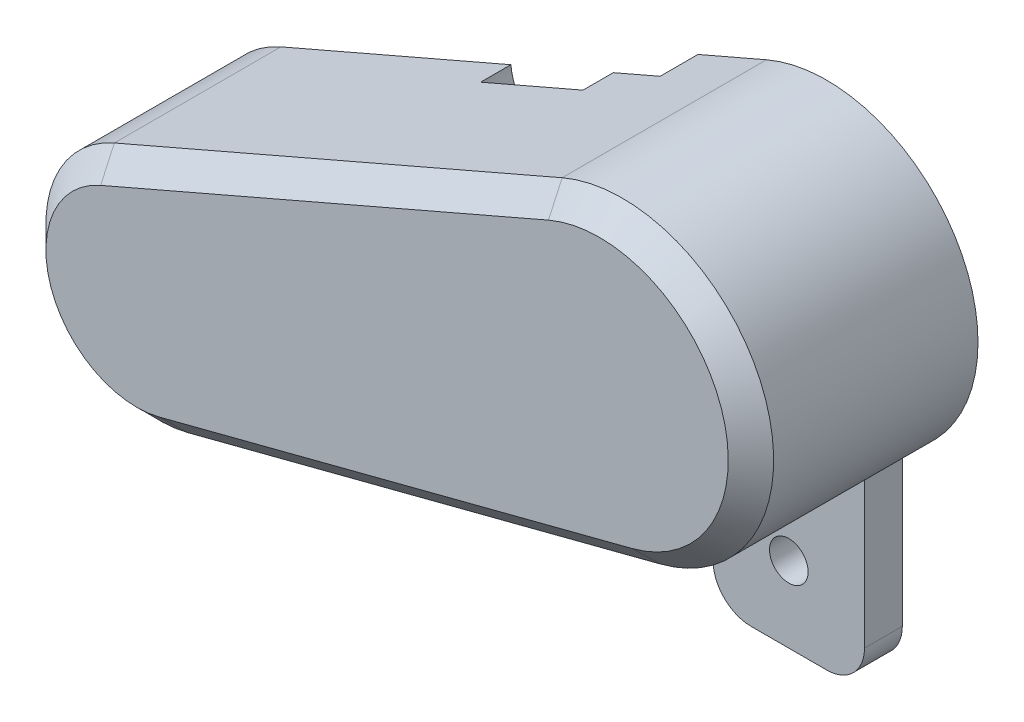
ISO-10303-21;
HEADER;
FILE_DESCRIPTION(('STEP AP214'),'2;1');
FILE_NAME('part.step','',(''),(''),'','','');
FILE_SCHEMA(('AUTOMOTIVE_DESIGN { 1 0 10303 214 1 1 1 1 }'));
ENDSEC;
DATA;
#1=APPLICATION_CONTEXT('core data for automotive mechanical design processes');
#2=APPLICATION_PROTOCOL_DEFINITION('international standard','automotive_design',2000,#1);
#3=PRODUCT_CONTEXT('',#1,'mechanical');
#4=PRODUCT('Part','Part','',(#3));
#5=PRODUCT_RELATED_PRODUCT_CATEGORY('part','',(#4));
#6=PRODUCT_DEFINITION_FORMATION('','',#4);
#7=PRODUCT_DEFINITION_CONTEXT('part definition',#1,'design');
#8=PRODUCT_DEFINITION('design','',#6,#7);
#9=PRODUCT_DEFINITION_SHAPE('','',#8);
#10=(LENGTH_UNIT() NAMED_UNIT(*) SI_UNIT(.MILLI.,.METRE.));
#11=(NAMED_UNIT(*) PLANE_ANGLE_UNIT() SI_UNIT($,.RADIAN.));
#12=(NAMED_UNIT(*) SI_UNIT($,.STERADIAN.) SOLID_ANGLE_UNIT());
#13=UNCERTAINTY_MEASURE_WITH_UNIT(LENGTH_MEASURE(1.E-05),#10,'distance_accuracy_value','');
#14=(GEOMETRIC_REPRESENTATION_CONTEXT(3) GLOBAL_UNCERTAINTY_ASSIGNED_CONTEXT((#13)) GLOBAL_UNIT_ASSIGNED_CONTEXT((#10,
#11,#12)) REPRESENTATION_CONTEXT('',''));
#15=CARTESIAN_POINT('',(0.,0.,0.));
#16=DIRECTION('',(0.,0.,1.));
#17=DIRECTION('',(1.,0.,0.));
#18=AXIS2_PLACEMENT_3D('',#15,#16,#17);
#19=CARTESIAN_POINT('',(-48.1077623284354,-39.7505775901013,30.));
#20=DIRECTION('',(0.39718415521736,-0.91773893174708,0.));
#21=DIRECTION('',(0.91773893174708,0.39718415521736,0.));
#22=AXIS2_PLACEMENT_3D('',#19,#20,#21);
#23=PLANE('',#22);
#24=DIRECTION('',(0.,0.,-1.));
#25=VECTOR('',#24,1.);
#26=CARTESIAN_POINT('',(-17.7154879863189,-26.5972401951977,9.));
#27=LINE('',#26,#25);
#28=CARTESIAN_POINT('',(-17.7154879863189,-26.5972401951977,5.));
#29=VERTEX_POINT('',#28);
#30=CARTESIAN_POINT('',(-17.7154879863189,-26.5972401951977,9.));
#31=VERTEX_POINT('',#30);
#32=EDGE_CURVE('E277',#29,#31,#27,.F.);
#33=ORIENTED_EDGE('',*,*,#32,.F.);
#34=DIRECTION('',(0.91773893174708,0.39718415521736,0.));
#35=VECTOR('',#34,1.);
#36=CARTESIAN_POINT('',(-48.1077623284354,-39.7505775901013,5.));
#37=LINE('',#36,#35);
#38=CARTESIAN_POINT('',(-48.1077623284354,-39.7505775901013,5.));
#39=VERTEX_POINT('',#38);
#40=EDGE_CURVE('E306',#39,#29,#37,.T.);
#41=ORIENTED_EDGE('',*,*,#40,.F.);
#42=DIRECTION('',(0.,0.,-1.));
#43=VECTOR('',#42,1.);
#44=CARTESIAN_POINT('',(-48.1077623284354,-39.7505775901013,30.));
#45=LINE('',#44,#43);
#46=CARTESIAN_POINT('',(-48.1077623284354,-39.7505775901013,27.));
#47=VERTEX_POINT('',#46);
#48=EDGE_CURVE('E337',#47,#39,#45,.T.);
#49=ORIENTED_EDGE('',*,*,#48,.F.);
#50=DIRECTION('',(0.91773893174708,0.39718415521736,0.));
#51=VECTOR('',#50,1.);
#52=CARTESIAN_POINT('',(11.0563104581527,-14.1452213650747,27.));
#53=LINE('',#52,#51);
#54=CARTESIAN_POINT('',(11.0563104581527,-14.1452213650747,27.));
#55=VERTEX_POINT('',#54);
#56=EDGE_CURVE('E386',#47,#55,#53,.T.);
#57=ORIENTED_EDGE('',*,*,#56,.T.);
#58=DIRECTION('',(0.,0.,-1.));
#59=VECTOR('',#58,1.);
#60=CARTESIAN_POINT('',(11.0563104581527,-14.1452213650747,30.));
#61=LINE('',#60,#59);
#62=CARTESIAN_POINT('',(11.0563104581527,-14.1452213650747,0.));
#63=VERTEX_POINT('',#62);
#64=EDGE_CURVE('E341',#55,#63,#61,.T.);
#65=ORIENTED_EDGE('',*,*,#64,.T.);
#66=DIRECTION('',(-0.91773893174708,-0.39718415521736,0.));
#67=VECTOR('',#66,1.);
#68=CARTESIAN_POINT('',(-48.1077623284354,-39.7505775901013,0.));
#69=LINE('',#68,#67);
#70=CARTESIAN_POINT('',(1.99999500305355,-18.0646638982228,0.));
#71=VERTEX_POINT('',#70);
#72=EDGE_CURVE('E327',#63,#71,#69,.T.);
#73=ORIENTED_EDGE('',*,*,#72,.T.);
#74=DIRECTION('',(0.,0.,-1.));
#75=VECTOR('',#74,1.);
#76=CARTESIAN_POINT('',(1.99999500305355,-18.0646638982228,30.));
#77=LINE('',#76,#75);
#78=CARTESIAN_POINT('',(1.99999500305355,-18.0646638982228,5.));
#79=VERTEX_POINT('',#78);
#80=EDGE_CURVE('E291',#79,#71,#77,.T.);
#81=ORIENTED_EDGE('',*,*,#80,.F.);
#82=CARTESIAN_POINT('',(-4.18622111210832,-20.7419688884504,5.));
#83=VERTEX_POINT('',#82);
#84=EDGE_CURVE('E305',#83,#79,#37,.T.);
#85=ORIENTED_EDGE('',*,*,#84,.F.);
#86=DIRECTION('',(0.,0.,-1.));
#87=VECTOR('',#86,1.);
#88=CARTESIAN_POINT('',(-4.18622111210832,-20.7419688884504,9.));
#89=LINE('',#88,#87);
#90=CARTESIAN_POINT('',(-4.18622111210832,-20.7419688884504,9.));
#91=VERTEX_POINT('',#90);
#92=EDGE_CURVE('E275',#91,#83,#89,.T.);
#93=ORIENTED_EDGE('',*,*,#92,.F.);
#94=DIRECTION('',(-0.91773893174708,-0.39718415521736,0.));
#95=VECTOR('',#94,1.);
#96=CARTESIAN_POINT('',(-48.1077623284354,-39.7505775901013,9.));
#97=LINE('',#96,#95);
#98=EDGE_CURVE('E279',#91,#31,#97,.T.);
#99=ORIENTED_EDGE('',*,*,#98,.T.);
#100=EDGE_LOOP('',(#33,#41,#49,#57,#65,#73,#81,#85,#93,#99));
#101=FACE_BOUND('',#100,.T.);
#102=ADVANCED_FACE('F32',(#101),#23,.F.);
#103=CARTESIAN_POINT('',(-46.9162098627834,-42.5037943853426,-111.277525292104));
#104=DIRECTION('',(0.39718415521736,-0.91773893174708,0.));
#105=DIRECTION('',(0.91773893174708,0.39718415521736,0.));
#106=AXIS2_PLACEMENT_3D('',#103,#104,#105);
#107=PLANE('',#106);
#108=DIRECTION('',(0.91773893174708,0.39718415521736,0.));
#109=VECTOR('',#108,1.);
#110=CARTESIAN_POINT('',(-46.9162098627834,-42.5037943853426,5.));
#111=LINE('',#110,#109);
#112=CARTESIAN_POINT('',(-46.9162098627834,-42.5037943853426,5.));
#113=VERTEX_POINT('',#112);
#114=CARTESIAN_POINT('',(-16.8500010206727,-29.4915734296411,5.));
#115=VERTEX_POINT('',#114);
#116=EDGE_CURVE('E302',#113,#115,#111,.T.);
#117=ORIENTED_EDGE('',*,*,#116,.T.);
#118=DIRECTION('',(0.,0.,-1.));
#119=VECTOR('',#118,1.);
#120=CARTESIAN_POINT('',(-16.8500010206727,-29.4915734296411,9.));
#121=LINE('',#120,#119);
#122=CARTESIAN_POINT('',(-16.8500010206727,-29.4915734296411,9.));
#123=VERTEX_POINT('',#122);
#124=EDGE_CURVE('E272',#115,#123,#121,.F.);
#125=ORIENTED_EDGE('',*,*,#124,.T.);
#126=DIRECTION('',(-0.91773893174708,-0.39718415521736,0.));
#127=VECTOR('',#126,1.);
#128=CARTESIAN_POINT('',(-46.9162098627834,-42.5037943853426,9.00000000000001));
#129=LINE('',#128,#127);
#130=CARTESIAN_POINT('',(-2.66860314645035,-23.3540692444895,9.));
#131=VERTEX_POINT('',#130);
#132=EDGE_CURVE('E11',#131,#123,#129,.T.);
#133=ORIENTED_EDGE('',*,*,#132,.F.);
#134=DIRECTION('',(0.,0.,-1.));
#135=VECTOR('',#134,1.);
#136=CARTESIAN_POINT('',(-2.66860314645035,-23.3540692444895,9.));
#137=LINE('',#136,#135);
#138=CARTESIAN_POINT('',(-2.66860314645035,-23.3540692444895,5.));
#139=VERTEX_POINT('',#138);
#140=EDGE_CURVE('E266',#131,#139,#137,.T.);
#141=ORIENTED_EDGE('',*,*,#140,.T.);
#142=CARTESIAN_POINT('',(1.99999584931487,-21.3335670253544,5.));
#143=VERTEX_POINT('',#142);
#144=EDGE_CURVE('E301',#139,#143,#111,.T.);
#145=ORIENTED_EDGE('',*,*,#144,.T.);
#146=DIRECTION('',(0.,0.,-1.));
#147=VECTOR('',#146,1.);
#148=CARTESIAN_POINT('',(1.99999584931487,-21.3335670253544,-111.277525292104));
#149=LINE('',#148,#147);
#150=CARTESIAN_POINT('',(1.99999584931487,-21.3335670253544,0.));
#151=VERTEX_POINT('',#150);
#152=EDGE_CURVE('E288',#143,#151,#149,.T.);
#153=ORIENTED_EDGE('',*,*,#152,.T.);
#154=DIRECTION('',(-0.91773893174708,-0.39718415521736,0.));
#155=VECTOR('',#154,1.);
#156=CARTESIAN_POINT('',(-46.9162098627834,-42.5037943853426,0.));
#157=LINE('',#156,#155);
#158=CARTESIAN_POINT('',(12.2478629238048,-16.8984381603159,0.));
#159=VERTEX_POINT('',#158);
#160=EDGE_CURVE('E334',#159,#151,#157,.T.);
#161=ORIENTED_EDGE('',*,*,#160,.F.);
#162=DIRECTION('',(0.,0.,1.));
#163=VECTOR('',#162,1.);
#164=CARTESIAN_POINT('',(12.2478629238048,-16.8984381603159,-111.277525292104));
#165=LINE('',#164,#163);
#166=CARTESIAN_POINT('',(12.2478629238048,-16.8984381603159,24.));
#167=VERTEX_POINT('',#166);
#168=EDGE_CURVE('E320',#159,#167,#165,.T.);
#169=ORIENTED_EDGE('',*,*,#168,.T.);
#170=DIRECTION('',(-0.91773893174708,-0.39718415521736,0.));
#171=VECTOR('',#170,1.);
#172=CARTESIAN_POINT('',(-46.9162098627834,-42.5037943853426,24.));
#173=LINE('',#172,#171);
#174=CARTESIAN_POINT('',(-46.9162098627834,-42.5037943853426,24.));
#175=VERTEX_POINT('',#174);
#176=EDGE_CURVE('E367',#167,#175,#173,.T.);
#177=ORIENTED_EDGE('',*,*,#176,.T.);
#178=DIRECTION('',(0.,0.,1.));
#179=VECTOR('',#178,1.);
#180=CARTESIAN_POINT('',(-46.9162098627834,-42.5037943853426,-111.277525292104));
#181=LINE('',#180,#179);
#182=EDGE_CURVE('E318',#113,#175,#181,.T.);
#183=ORIENTED_EDGE('',*,*,#182,.F.);
#184=EDGE_LOOP('',(#117,#125,#133,#141,#145,#153,#161,#169,#177,#183));
#185=FACE_BOUND('',#184,.T.);
#186=ADVANCED_FACE('F420',(#185),#107,.T.);
#187=CARTESIAN_POINT('',(0.,0.,5.));
#188=DIRECTION('',(0.,0.,-1.));
#189=DIRECTION('',(-1.,0.,0.));
#190=AXIS2_PLACEMENT_3D('',#187,#188,#189);
#191=PLANE('',#190);
#192=ORIENTED_EDGE('',*,*,#40,.T.);
#193=CARTESIAN_POINT('',(-9.99999999999934,-25.86666156633,5.));
#194=DIRECTION('',(0.,0.,-1.));
#195=DIRECTION('',(-1.,0.,0.));
#196=AXIS2_PLACEMENT_3D('',#193,#194,#195);
#197=CIRCLE('',#196,7.75);
#198=EDGE_CURVE('E40',#29,#115,#197,.F.);
#199=ORIENTED_EDGE('',*,*,#198,.T.);
#200=ORIENTED_EDGE('',*,*,#116,.F.);
#201=CARTESIAN_POINT('',(-42.150000000175,-53.5166615663075,5.));
#202=DIRECTION('',(0.,0.,-1.));
#203=DIRECTION('',(-1.,0.,0.));
#204=AXIS2_PLACEMENT_3D('',#201,#202,#203);
#205=CIRCLE('',#204,12.);
#206=CARTESIAN_POINT('',(-39.1388633279181,-65.1327304340867,5.));
#207=VERTEX_POINT('',#206);
#208=EDGE_CURVE('E298',#207,#113,#205,.T.);
#209=ORIENTED_EDGE('',*,*,#208,.F.);
#210=DIRECTION('',(-0.968005738981601,-0.250928056021413,0.));
#211=VECTOR('',#210,1.);
#212=CARTESIAN_POINT('',(23.2657705148639,-48.9560975627035,5.));
#213=LINE('',#212,#211);
#214=CARTESIAN_POINT('',(-17.9999999999844,-59.6530791595383,5.));
#215=VERTEX_POINT('',#214);
#216=EDGE_CURVE('E410',#215,#207,#213,.T.);
#217=ORIENTED_EDGE('',*,*,#216,.F.);
#218=DIRECTION('',(0.,-1.,0.));
#219=VECTOR('',#218,1.);
#220=CARTESIAN_POINT('',(-17.9999999999844,-39.3666615663736,5.));
#221=LINE('',#220,#219);
#222=CARTESIAN_POINT('',(-17.9999999999844,-62.752234339296,5.));
#223=VERTEX_POINT('',#222);
#224=EDGE_CURVE('E285',#215,#223,#221,.T.);
#225=ORIENTED_EDGE('',*,*,#224,.T.);
#226=DIRECTION('',(-0.968005738981601,-0.250928056021413,0.));
#227=VECTOR('',#226,1.);
#228=CARTESIAN_POINT('',(-38.3860791598538,-68.0367476510315,5.));
#229=LINE('',#228,#227);
#230=CARTESIAN_POINT('',(-38.3860791598538,-68.0367476510315,5.));
#231=VERTEX_POINT('',#230);
#232=EDGE_CURVE('E311',#223,#231,#229,.T.);
#233=ORIENTED_EDGE('',*,*,#232,.T.);
#234=CARTESIAN_POINT('',(-42.150000000175,-53.5166615663075,5.));
#235=DIRECTION('',(0.,0.,-1.));
#236=DIRECTION('',(-1.,0.,0.));
#237=AXIS2_PLACEMENT_3D('',#234,#235,#236);
#238=CIRCLE('',#237,15.);
#239=EDGE_CURVE('E309',#231,#39,#238,.T.);
#240=ORIENTED_EDGE('',*,*,#239,.T.);
#241=EDGE_LOOP('',(#192,#199,#200,#209,#217,#225,#233,#240));
#242=FACE_BOUND('',#241,.T.);
#243=ADVANCED_FACE('F414',(#242),#191,.T.);
#244=ORIENTED_EDGE('',*,*,#144,.F.);
#245=CARTESIAN_POINT('',(-9.99999999999934,-25.86666156633,5.));
#246=DIRECTION('',(0.,0.,1.));
#247=DIRECTION('',(1.,0.,0.));
#248=AXIS2_PLACEMENT_3D('',#245,#246,#247);
#249=CIRCLE('',#248,7.75);
#250=EDGE_CURVE('E256',#139,#83,#249,.T.);
#251=ORIENTED_EDGE('',*,*,#250,.T.);
#252=ORIENTED_EDGE('',*,*,#84,.T.);
#253=DIRECTION('',(2.58882350467473E-07,-0.999999999999966,0.));
#254=VECTOR('',#253,1.);
#255=CARTESIAN_POINT('',(1.99999304469558,-10.5000000000155,5.));
#256=LINE('',#255,#254);
#257=EDGE_CURVE('E282',#79,#143,#256,.T.);
#258=ORIENTED_EDGE('',*,*,#257,.T.);
#259=EDGE_LOOP('',(#244,#251,#252,#258));
#260=FACE_BOUND('',#259,.T.);
#261=ADVANCED_FACE('F489',(#260),#191,.T.);
#262=CARTESIAN_POINT('',(-42.150000000175,-53.5166615663075,30.));
#263=DIRECTION('',(0.,0.,-1.));
#264=DIRECTION('',(-1.,0.,0.));
#265=AXIS2_PLACEMENT_3D('',#262,#263,#264);
#266=CYLINDRICAL_SURFACE('',#265,15.);
#267=ORIENTED_EDGE('',*,*,#239,.F.);
#268=DIRECTION('',(0.,0.,-1.));
#269=VECTOR('',#268,1.);
#270=CARTESIAN_POINT('',(-38.3860791598538,-68.0367476510315,30.));
#271=LINE('',#270,#269);
#272=CARTESIAN_POINT('',(-38.3860791598538,-68.0367476510315,27.));
#273=VERTEX_POINT('',#272);
#274=EDGE_CURVE('E347',#273,#231,#271,.T.);
#275=ORIENTED_EDGE('',*,*,#274,.F.);
#276=CARTESIAN_POINT('',(-42.150000000175,-53.5166615663075,27.));
#277=DIRECTION('',(0.,0.,1.));
#278=DIRECTION('',(1.,0.,0.));
#279=AXIS2_PLACEMENT_3D('',#276,#277,#278);
#280=CIRCLE('',#279,15.);
#281=EDGE_CURVE('E384',#273,#47,#280,.F.);
#282=ORIENTED_EDGE('',*,*,#281,.T.);
#283=ORIENTED_EDGE('',*,*,#48,.T.);
#284=EDGE_LOOP('',(#267,#275,#282,#283));
#285=FACE_BOUND('',#284,.T.);
#286=ADVANCED_FACE('F486',(#285),#266,.T.);
#287=CARTESIAN_POINT('',(-38.3860791598538,-68.0367476510315,30.));
#288=DIRECTION('',(-0.250928056021413,0.9680057389816,0.));
#289=DIRECTION('',(-0.968005738981601,-0.250928056021413,0.));
#290=AXIS2_PLACEMENT_3D('',#287,#288,#289);
#291=PLANE('',#290);
#292=DIRECTION('',(0.968005738981601,0.250928056021413,0.));
#293=VECTOR('',#292,1.);
#294=CARTESIAN_POINT('',(24.0185546829281,-51.8601147796483,0.));
#295=LINE('',#294,#293);
#296=CARTESIAN_POINT('',(-17.9999999999844,-62.752234339296,0.));
#297=VERTEX_POINT('',#296);
#298=CARTESIAN_POINT('',(8.99999356249987,-55.7532511469519,0.));
#299=VERTEX_POINT('',#298);
#300=EDGE_CURVE('E52',#297,#299,#295,.T.);
#301=ORIENTED_EDGE('',*,*,#300,.T.);
#302=DIRECTION('',(0.,0.,-1.));
#303=VECTOR('',#302,1.);
#304=CARTESIAN_POINT('',(8.99999356249987,-55.7532511469519,5.));
#305=LINE('',#304,#303);
#306=CARTESIAN_POINT('',(8.99999356249987,-55.7532511469519,5.));
#307=VERTEX_POINT('',#306);
#308=EDGE_CURVE('E47',#307,#299,#305,.T.);
#309=ORIENTED_EDGE('',*,*,#308,.F.);
#310=DIRECTION('',(0.9680057389816,0.250928056021413,0.));
#311=VECTOR('',#310,1.);
#312=CARTESIAN_POINT('',(8.99999356249987,-55.7532511469519,5.));
#313=LINE('',#312,#311);
#314=CARTESIAN_POINT('',(24.0185546829281,-51.8601147796483,5.));
#315=VERTEX_POINT('',#314);
#316=EDGE_CURVE('E231',#307,#315,#313,.T.);
#317=ORIENTED_EDGE('',*,*,#316,.T.);
#318=DIRECTION('',(0.,0.,-1.));
#319=VECTOR('',#318,1.);
#320=CARTESIAN_POINT('',(24.0185546829281,-51.8601147796483,30.));
#321=LINE('',#320,#319);
#322=CARTESIAN_POINT('',(24.0185546829281,-51.8601147796483,27.));
#323=VERTEX_POINT('',#322);
#324=EDGE_CURVE('E344',#323,#315,#321,.T.);
#325=ORIENTED_EDGE('',*,*,#324,.F.);
#326=DIRECTION('',(-0.968005738981601,-0.250928056021413,0.));
#327=VECTOR('',#326,1.);
#328=CARTESIAN_POINT('',(-38.3860791598538,-68.0367476510315,27.));
#329=LINE('',#328,#327);
#330=EDGE_CURVE('E379',#323,#273,#329,.T.);
#331=ORIENTED_EDGE('',*,*,#330,.T.);
#332=ORIENTED_EDGE('',*,*,#274,.T.);
#333=ORIENTED_EDGE('',*,*,#232,.F.);
#334=DIRECTION('',(0.,0.,1.));
#335=VECTOR('',#334,1.);
#336=CARTESIAN_POINT('',(-17.9999999999844,-62.752234339296,30.));
#337=LINE('',#336,#335);
#338=EDGE_CURVE('E296',#297,#223,#337,.T.);
#339=ORIENTED_EDGE('',*,*,#338,.F.);
#340=EDGE_LOOP('',(#301,#309,#317,#325,#331,#332,#333,#339));
#341=FACE_BOUND('',#340,.T.);
#342=ADVANCED_FACE('F483',(#341),#291,.F.);
#343=CARTESIAN_POINT('',(-42.150000000175,-53.5166615663075,-111.277525292104));
#344=DIRECTION('',(0.,0.,1.));
#345=DIRECTION('',(1.,0.,0.));
#346=AXIS2_PLACEMENT_3D('',#343,#344,#345);
#347=CYLINDRICAL_SURFACE('',#346,12.);
#348=DIRECTION('',(0.,0.,1.));
#349=VECTOR('',#348,1.);
#350=CARTESIAN_POINT('',(-39.1388633279181,-65.1327304340867,-111.277525292104));
#351=LINE('',#350,#349);
#352=CARTESIAN_POINT('',(-39.1388633279181,-65.1327304340867,24.));
#353=VERTEX_POINT('',#352);
#354=EDGE_CURVE('E317',#207,#353,#351,.T.);
#355=ORIENTED_EDGE('',*,*,#354,.F.);
#356=ORIENTED_EDGE('',*,*,#208,.T.);
#357=ORIENTED_EDGE('',*,*,#182,.T.);
#358=CARTESIAN_POINT('',(-42.150000000175,-53.5166615663075,24.));
#359=DIRECTION('',(0.,0.,1.));
#360=DIRECTION('',(1.,0.,0.));
#361=AXIS2_PLACEMENT_3D('',#358,#359,#360);
#362=CIRCLE('',#361,12.);
#363=EDGE_CURVE('E362',#175,#353,#362,.T.);
#364=ORIENTED_EDGE('',*,*,#363,.T.);
#365=EDGE_LOOP('',(#355,#356,#357,#364));
#366=FACE_BOUND('',#365,.T.);
#367=ADVANCED_FACE('F426',(#366),#347,.F.);
#368=CARTESIAN_POINT('',(23.2657705148639,-48.9560975627035,-111.277525292104));
#369=DIRECTION('',(-0.250928056021413,0.9680057389816,0.));
#370=DIRECTION('',(-0.968005738981601,-0.250928056021413,0.));
#371=AXIS2_PLACEMENT_3D('',#368,#369,#370);
#372=PLANE('',#371);
#373=DIRECTION('',(0.,0.,1.));
#374=VECTOR('',#373,1.);
#375=CARTESIAN_POINT('',(-17.9999999999844,-59.6530791595383,-111.277525292104));
#376=LINE('',#375,#374);
#377=CARTESIAN_POINT('',(-17.9999999999844,-59.6530791595383,0.));
#378=VERTEX_POINT('',#377);
#379=EDGE_CURVE('E293',#378,#215,#376,.T.);
#380=ORIENTED_EDGE('',*,*,#379,.T.);
#381=ORIENTED_EDGE('',*,*,#216,.T.);
#382=ORIENTED_EDGE('',*,*,#354,.T.);
#383=DIRECTION('',(0.968005738981601,0.250928056021413,0.));
#384=VECTOR('',#383,1.);
#385=CARTESIAN_POINT('',(23.2657705148639,-48.9560975627035,24.));
#386=LINE('',#385,#384);
#387=CARTESIAN_POINT('',(23.2657705148639,-48.9560975627035,24.));
#388=VERTEX_POINT('',#387);
#389=EDGE_CURVE('E359',#353,#388,#386,.T.);
#390=ORIENTED_EDGE('',*,*,#389,.T.);
#391=DIRECTION('',(0.,0.,1.));
#392=VECTOR('',#391,1.);
#393=CARTESIAN_POINT('',(23.2657705148639,-48.9560975627035,-111.277525292104));
#394=LINE('',#393,#392);
#395=CARTESIAN_POINT('',(23.2657705148639,-48.9560975627035,0.));
#396=VERTEX_POINT('',#395);
#397=EDGE_CURVE('E323',#396,#388,#394,.T.);
#398=ORIENTED_EDGE('',*,*,#397,.F.);
#399=DIRECTION('',(0.968005738981601,0.250928056021413,0.));
#400=VECTOR('',#399,1.);
#401=CARTESIAN_POINT('',(23.2657705148639,-48.9560975627035,0.));
#402=LINE('',#401,#400);
#403=EDGE_CURVE('E314',#378,#396,#402,.T.);
#404=ORIENTED_EDGE('',*,*,#403,.F.);
#405=EDGE_LOOP('',(#380,#381,#382,#390,#398,#404));
#406=FACE_BOUND('',#405,.T.);
#407=ADVANCED_FACE('F431',(#406),#372,.T.);
#408=CARTESIAN_POINT('',(0.,0.,0.));
#409=DIRECTION('',(0.,0.,1.));
#410=DIRECTION('',(1.,0.,0.));
#411=AXIS2_PLACEMENT_3D('',#408,#409,#410);
#412=PLANE('',#411);
#413=DIRECTION('',(0.,-1.,0.));
#414=VECTOR('',#413,1.);
#415=CARTESIAN_POINT('',(-17.9999999999844,0.,0.));
#416=LINE('',#415,#414);
#417=EDGE_CURVE('E408',#378,#297,#416,.T.);
#418=ORIENTED_EDGE('',*,*,#417,.F.);
#419=ORIENTED_EDGE('',*,*,#403,.T.);
#420=CARTESIAN_POINT('',(18.9999935624999,-32.5000000000163,0.));
#421=DIRECTION('',(0.,0.,1.));
#422=DIRECTION('',(1.,0.,0.));
#423=AXIS2_PLACEMENT_3D('',#420,#421,#422);
#424=CIRCLE('',#423,17.);
#425=EDGE_CURVE('E316',#396,#159,#424,.T.);
#426=ORIENTED_EDGE('',*,*,#425,.T.);
#427=ORIENTED_EDGE('',*,*,#160,.T.);
#428=DIRECTION('',(2.58882350467473E-07,-0.999999999999966,0.));
#429=VECTOR('',#428,1.);
#430=CARTESIAN_POINT('',(1.99999032643076,5.17762196618621E-07,0.));
#431=LINE('',#430,#429);
#432=EDGE_CURVE('E388',#71,#151,#431,.T.);
#433=ORIENTED_EDGE('',*,*,#432,.F.);
#434=ORIENTED_EDGE('',*,*,#72,.F.);
#435=CARTESIAN_POINT('',(18.9999935624999,-32.5000000000163,0.));
#436=DIRECTION('',(0.,0.,1.));
#437=DIRECTION('',(1.,0.,0.));
#438=AXIS2_PLACEMENT_3D('',#435,#436,#437);
#439=CIRCLE('',#438,20.);
#440=CARTESIAN_POINT('',(28.9999935624999,-49.8205080757051,0.));
#441=VERTEX_POINT('',#440);
#442=EDGE_CURVE('E330',#441,#63,#439,.T.);
#443=ORIENTED_EDGE('',*,*,#442,.F.);
#444=DIRECTION('',(0.,-1.,0.));
#445=VECTOR('',#444,1.);
#446=CARTESIAN_POINT('',(28.9999935624999,-70.0000000000163,0.));
#447=LINE('',#446,#445);
#448=CARTESIAN_POINT('',(28.9999935624999,-70.0000000000163,0.));
#449=VERTEX_POINT('',#448);
#450=EDGE_CURVE('E242',#441,#449,#447,.T.);
#451=ORIENTED_EDGE('',*,*,#450,.T.);
#452=CARTESIAN_POINT('',(23.9999935624999,-70.0000000000163,0.));
#453=DIRECTION('',(0.,0.,-1.));
#454=DIRECTION('',(-1.,0.,0.));
#455=AXIS2_PLACEMENT_3D('',#452,#453,#454);
#456=CIRCLE('',#455,5.);
#457=CARTESIAN_POINT('',(23.9999935624999,-75.0000000000163,0.));
#458=VERTEX_POINT('',#457);
#459=EDGE_CURVE('E208',#449,#458,#456,.T.);
#460=ORIENTED_EDGE('',*,*,#459,.T.);
#461=DIRECTION('',(-1.,0.,0.));
#462=VECTOR('',#461,1.);
#463=CARTESIAN_POINT('',(13.9999935624999,-75.0000000000163,0.));
#464=LINE('',#463,#462);
#465=CARTESIAN_POINT('',(13.9999935624999,-75.0000000000163,0.));
#466=VERTEX_POINT('',#465);
#467=EDGE_CURVE('E246',#458,#466,#464,.T.);
#468=ORIENTED_EDGE('',*,*,#467,.T.);
#469=CARTESIAN_POINT('',(13.9999935624999,-70.0000000000163,0.));
#470=DIRECTION('',(0.,0.,-1.));
#471=DIRECTION('',(-1.,0.,0.));
#472=AXIS2_PLACEMENT_3D('',#469,#470,#471);
#473=CIRCLE('',#472,5.);
#474=CARTESIAN_POINT('',(8.99999356249987,-70.0000000000163,0.));
#475=VERTEX_POINT('',#474);
#476=EDGE_CURVE('E249',#466,#475,#473,.T.);
#477=ORIENTED_EDGE('',*,*,#476,.T.);
#478=DIRECTION('',(0.,1.,0.));
#479=VECTOR('',#478,1.);
#480=CARTESIAN_POINT('',(8.99999356249987,-55.7532511469519,0.));
#481=LINE('',#480,#479);
#482=EDGE_CURVE('E252',#475,#299,#481,.T.);
#483=ORIENTED_EDGE('',*,*,#482,.T.);
#484=ORIENTED_EDGE('',*,*,#300,.F.);
#485=EDGE_LOOP('',(#418,#419,#426,#427,#433,#434,#443,#451,#460,#468,#477,#483,#484));
#486=FACE_BOUND('',#485,.T.);
#487=CARTESIAN_POINT('',(18.9999935624999,-65.0000000000163,0.));
#488=DIRECTION('',(0.,0.,-1.));
#489=DIRECTION('',(-1.,0.,0.));
#490=AXIS2_PLACEMENT_3D('',#487,#488,#489);
#491=CIRCLE('',#490,2.55);
#492=CARTESIAN_POINT('',(16.4499935624999,-65.0000000000163,0.));
#493=VERTEX_POINT('',#492);
#494=EDGE_CURVE('E448',#493,#493,#491,.T.);
#495=ORIENTED_EDGE('',*,*,#494,.F.);
#496=EDGE_LOOP('',(#495));
#497=FACE_BOUND('',#496,.T.);
#498=ADVANCED_FACE('F438',(#486,#497),#412,.F.);
#499=CARTESIAN_POINT('',(18.9999935624999,-32.5000000000163,30.));
#500=DIRECTION('',(0.,0.,-1.));
#501=DIRECTION('',(-1.,0.,0.));
#502=AXIS2_PLACEMENT_3D('',#499,#500,#501);
#503=CYLINDRICAL_SURFACE('',#502,20.);
#504=CARTESIAN_POINT('',(18.9999935624999,-32.5000000000163,5.));
#505=DIRECTION('',(0.,0.,1.));
#506=DIRECTION('',(-1.,0.,0.));
#507=AXIS2_PLACEMENT_3D('',#504,#505,#506);
#508=CIRCLE('',#507,20.);
#509=CARTESIAN_POINT('',(28.9999935624999,-49.8205080757051,5.));
#510=VERTEX_POINT('',#509);
#511=EDGE_CURVE('E229',#315,#510,#508,.T.);
#512=ORIENTED_EDGE('',*,*,#511,.T.);
#513=DIRECTION('',(0.,0.,-1.));
#514=VECTOR('',#513,1.);
#515=CARTESIAN_POINT('',(28.9999935624999,-49.8205080757051,5.));
#516=LINE('',#515,#514);
#517=EDGE_CURVE('E214',#510,#441,#516,.T.);
#518=ORIENTED_EDGE('',*,*,#517,.T.);
#519=ORIENTED_EDGE('',*,*,#442,.T.);
#520=ORIENTED_EDGE('',*,*,#64,.F.);
#521=CARTESIAN_POINT('',(18.9999935624999,-32.5000000000163,27.));
#522=DIRECTION('',(0.,0.,1.));
#523=DIRECTION('',(1.,0.,0.));
#524=AXIS2_PLACEMENT_3D('',#521,#522,#523);
#525=CIRCLE('',#524,20.);
#526=EDGE_CURVE('E382',#55,#323,#525,.F.);
#527=ORIENTED_EDGE('',*,*,#526,.T.);
#528=ORIENTED_EDGE('',*,*,#324,.T.);
#529=EDGE_LOOP('',(#512,#518,#519,#520,#527,#528));
#530=FACE_BOUND('',#529,.T.);
#531=ADVANCED_FACE('F461',(#530),#503,.T.);
#532=CARTESIAN_POINT('',(-42.150000000175,-53.5166615663075,30.));
#533=DIRECTION('',(0.,0.,1.));
#534=DIRECTION('',(1.,0.,0.));
#535=AXIS2_PLACEMENT_3D('',#532,#533,#534);
#536=PLANE('',#535);
#537=CARTESIAN_POINT('',(-42.150000000175,-53.5166615663075,30.));
#538=DIRECTION('',(0.,0.,1.));
#539=DIRECTION('',(1.,0.,0.));
#540=AXIS2_PLACEMENT_3D('',#537,#538,#539);
#541=CIRCLE('',#540,12.);
#542=CARTESIAN_POINT('',(-46.9162098627834,-42.5037943853426,30.));
#543=VERTEX_POINT('',#542);
#544=CARTESIAN_POINT('',(-39.1388633279181,-65.1327304340867,30.));
#545=VERTEX_POINT('',#544);
#546=EDGE_CURVE('E372',#543,#545,#541,.T.);
#547=ORIENTED_EDGE('',*,*,#546,.T.);
#548=DIRECTION('',(0.968005738981601,0.250928056021413,0.));
#549=VECTOR('',#548,1.);
#550=CARTESIAN_POINT('',(23.2657705148639,-48.9560975627035,30.));
#551=LINE('',#550,#549);
#552=CARTESIAN_POINT('',(23.2657705148639,-48.9560975627035,30.));
#553=VERTEX_POINT('',#552);
#554=EDGE_CURVE('E376',#545,#553,#551,.T.);
#555=ORIENTED_EDGE('',*,*,#554,.T.);
#556=CARTESIAN_POINT('',(18.9999935624999,-32.5000000000163,30.));
#557=DIRECTION('',(0.,0.,1.));
#558=DIRECTION('',(1.,0.,0.));
#559=AXIS2_PLACEMENT_3D('',#556,#557,#558);
#560=CIRCLE('',#559,17.);
#561=CARTESIAN_POINT('',(12.2478629238048,-16.8984381603159,30.));
#562=VERTEX_POINT('',#561);
#563=EDGE_CURVE('E374',#553,#562,#560,.T.);
#564=ORIENTED_EDGE('',*,*,#563,.T.);
#565=DIRECTION('',(-0.91773893174708,-0.39718415521736,0.));
#566=VECTOR('',#565,1.);
#567=CARTESIAN_POINT('',(-46.9162098627834,-42.5037943853426,30.));
#568=LINE('',#567,#566);
#569=EDGE_CURVE('E370',#562,#543,#568,.T.);
#570=ORIENTED_EDGE('',*,*,#569,.T.);
#571=EDGE_LOOP('',(#547,#555,#564,#570));
#572=FACE_BOUND('',#571,.T.);
#573=ADVANCED_FACE('F467',(#572),#536,.T.);
#574=CARTESIAN_POINT('',(18.9999935624999,-32.5000000000163,-111.277525292104));
#575=DIRECTION('',(0.,0.,1.));
#576=DIRECTION('',(1.,0.,0.));
#577=AXIS2_PLACEMENT_3D('',#574,#575,#576);
#578=CYLINDRICAL_SURFACE('',#577,17.);
#579=ORIENTED_EDGE('',*,*,#397,.T.);
#580=CARTESIAN_POINT('',(18.9999935624999,-32.5000000000163,24.));
#581=DIRECTION('',(0.,0.,1.));
#582=DIRECTION('',(1.,0.,0.));
#583=AXIS2_PLACEMENT_3D('',#580,#581,#582);
#584=CIRCLE('',#583,17.);
#585=EDGE_CURVE('E365',#388,#167,#584,.T.);
#586=ORIENTED_EDGE('',*,*,#585,.T.);
#587=ORIENTED_EDGE('',*,*,#168,.F.);
#588=ORIENTED_EDGE('',*,*,#425,.F.);
#589=EDGE_LOOP('',(#579,#586,#587,#588));
#590=FACE_BOUND('',#589,.T.);
#591=ADVANCED_FACE('F559',(#590),#578,.F.);
#592=CARTESIAN_POINT('',(-42.150000000175,-53.5166615663075,27.));
#593=DIRECTION('',(0.,0.,1.));
#594=DIRECTION('',(1.,0.,0.));
#595=AXIS2_PLACEMENT_3D('',#592,#593,#594);
#596=PLANE('',#595);
#597=CARTESIAN_POINT('',(18.9999935624999,-32.5000000000163,27.));
#598=DIRECTION('',(0.,0.,1.));
#599=DIRECTION('',(1.,0.,0.));
#600=AXIS2_PLACEMENT_3D('',#597,#598,#599);
#601=CIRCLE('',#600,14.);
#602=CARTESIAN_POINT('',(13.4394153894568,-19.6516549555572,27.));
#603=VERTEX_POINT('',#602);
#604=CARTESIAN_POINT('',(22.5129863467997,-46.0520803457587,27.));
#605=VERTEX_POINT('',#604);
#606=EDGE_CURVE('E352',#603,#605,#601,.F.);
#607=ORIENTED_EDGE('',*,*,#606,.T.);
#608=DIRECTION('',(-0.968005738981601,-0.250928056021413,0.));
#609=VECTOR('',#608,1.);
#610=CARTESIAN_POINT('',(-39.8916474959823,-62.2287132171419,27.));
#611=LINE('',#610,#609);
#612=CARTESIAN_POINT('',(-39.8916474959823,-62.2287132171419,27.));
#613=VERTEX_POINT('',#612);
#614=EDGE_CURVE('E356',#605,#613,#611,.T.);
#615=ORIENTED_EDGE('',*,*,#614,.T.);
#616=CARTESIAN_POINT('',(-42.150000000175,-53.5166615663075,27.));
#617=DIRECTION('',(0.,0.,1.));
#618=DIRECTION('',(1.,0.,0.));
#619=AXIS2_PLACEMENT_3D('',#616,#617,#618);
#620=CIRCLE('',#619,8.99999999999998);
#621=CARTESIAN_POINT('',(-45.7246573971313,-45.2570111805838,27.));
#622=VERTEX_POINT('',#621);
#623=EDGE_CURVE('E354',#613,#622,#620,.F.);
#624=ORIENTED_EDGE('',*,*,#623,.T.);
#625=DIRECTION('',(0.91773893174708,0.39718415521736,0.));
#626=VECTOR('',#625,1.);
#627=CARTESIAN_POINT('',(-45.7246573971313,-45.2570111805838,27.));
#628=LINE('',#627,#626);
#629=EDGE_CURVE('E350',#622,#603,#628,.T.);
#630=ORIENTED_EDGE('',*,*,#629,.T.);
#631=EDGE_LOOP('',(#607,#615,#624,#630));
#632=FACE_BOUND('',#631,.T.);
#633=ADVANCED_FACE('F481',(#632),#596,.F.);
#634=CARTESIAN_POINT('',(-45.7246573971313,-45.2570111805838,27.));
#635=DIRECTION('',(-0.280851609534044,0.648939421997256,0.70710678118655));
#636=DIRECTION('',(0.91773893174708,0.39718415521736,0.));
#637=AXIS2_PLACEMENT_3D('',#634,#635,#636);
#638=PLANE('',#637);
#639=DIRECTION('',(0.280851609534046,-0.648939421997262,0.707106781186544));
#640=VECTOR('',#639,1.);
#641=CARTESIAN_POINT('',(-46.9162098627834,-42.5037943853426,24.));
#642=LINE('',#641,#640);
#643=EDGE_CURVE('E394',#175,#622,#642,.T.);
#644=ORIENTED_EDGE('',*,*,#643,.F.);
#645=ORIENTED_EDGE('',*,*,#176,.F.);
#646=DIRECTION('',(-0.280851609534046,0.648939421997261,-0.707106781186545));
#647=VECTOR('',#646,1.);
#648=CARTESIAN_POINT('',(13.4394153894568,-19.6516549555572,27.));
#649=LINE('',#648,#647);
#650=EDGE_CURVE('E331',#603,#167,#649,.T.);
#651=ORIENTED_EDGE('',*,*,#650,.F.);
#652=ORIENTED_EDGE('',*,*,#629,.F.);
#653=EDGE_LOOP('',(#644,#645,#651,#652));
#654=FACE_BOUND('',#653,.T.);
#655=ADVANCED_FACE('F502',(#654),#638,.F.);
#656=CARTESIAN_POINT('',(18.9999935624999,-32.5000000000163,27.));
#657=DIRECTION('',(0.,0.,-1.));
#658=DIRECTION('',(-1.,0.,0.));
#659=AXIS2_PLACEMENT_3D('',#656,#657,#658);
#660=CONICAL_SURFACE('',#659,14.,0.785398163397452);
#661=ORIENTED_EDGE('',*,*,#650,.T.);
#662=ORIENTED_EDGE('',*,*,#585,.F.);
#663=DIRECTION('',(0.1774329300027,-0.684483422261387,-0.707106781186545));
#664=VECTOR('',#663,1.);
#665=CARTESIAN_POINT('',(22.5129863467997,-46.0520803457587,27.));
#666=LINE('',#665,#664);
#667=EDGE_CURVE('E391',#605,#388,#666,.T.);
#668=ORIENTED_EDGE('',*,*,#667,.F.);
#669=ORIENTED_EDGE('',*,*,#606,.F.);
#670=EDGE_LOOP('',(#661,#662,#668,#669));
#671=FACE_BOUND('',#670,.T.);
#672=ADVANCED_FACE('F498',(#671),#660,.F.);
#673=CARTESIAN_POINT('',(-42.150000000175,-53.5166615663075,27.));
#674=DIRECTION('',(0.,0.,-1.));
#675=DIRECTION('',(-1.,0.,0.));
#676=AXIS2_PLACEMENT_3D('',#673,#674,#675);
#677=CONICAL_SURFACE('',#676,8.99999999999998,0.785398163397452);
#678=ORIENTED_EDGE('',*,*,#643,.T.);
#679=ORIENTED_EDGE('',*,*,#623,.F.);
#680=DIRECTION('',(-0.177432930002701,0.684483422261387,0.707106781186545));
#681=VECTOR('',#680,1.);
#682=CARTESIAN_POINT('',(-39.1388633279181,-65.1327304340867,24.));
#683=LINE('',#682,#681);
#684=EDGE_CURVE('E389',#353,#613,#683,.T.);
#685=ORIENTED_EDGE('',*,*,#684,.F.);
#686=ORIENTED_EDGE('',*,*,#363,.F.);
#687=EDGE_LOOP('',(#678,#679,#685,#686));
#688=FACE_BOUND('',#687,.T.);
#689=ADVANCED_FACE('F494',(#688),#677,.F.);
#690=CARTESIAN_POINT('',(-39.8916474959823,-62.2287132171419,27.));
#691=DIRECTION('',(0.177432930002698,-0.684483422261382,0.707106781186551));
#692=DIRECTION('',(-0.968005738981601,-0.250928056021413,0.));
#693=AXIS2_PLACEMENT_3D('',#690,#691,#692);
#694=PLANE('',#693);
#695=ORIENTED_EDGE('',*,*,#667,.T.);
#696=ORIENTED_EDGE('',*,*,#389,.F.);
#697=ORIENTED_EDGE('',*,*,#684,.T.);
#698=ORIENTED_EDGE('',*,*,#614,.F.);
#699=EDGE_LOOP('',(#695,#696,#697,#698));
#700=FACE_BOUND('',#699,.T.);
#701=ADVANCED_FACE('F491',(#700),#694,.F.);
#702=CARTESIAN_POINT('',(-46.9162098627834,-42.5037943853426,30.));
#703=DIRECTION('',(-0.280851609534046,0.648939421997261,0.707106781186545));
#704=DIRECTION('',(0.91773893174708,0.39718415521736,0.));
#705=AXIS2_PLACEMENT_3D('',#702,#703,#704);
#706=PLANE('',#705);
#707=DIRECTION('',(0.280851609534045,-0.648939421997257,0.707106781186549));
#708=VECTOR('',#707,1.);
#709=CARTESIAN_POINT('',(11.0563104581527,-14.1452213650747,27.));
#710=LINE('',#709,#708);
#711=EDGE_CURVE('E402',#55,#562,#710,.T.);
#712=ORIENTED_EDGE('',*,*,#711,.F.);
#713=ORIENTED_EDGE('',*,*,#56,.F.);
#714=DIRECTION('',(-0.280851609534045,0.648939421997257,-0.707106781186549));
#715=VECTOR('',#714,1.);
#716=CARTESIAN_POINT('',(-46.9162098627834,-42.5037943853426,30.));
#717=LINE('',#716,#715);
#718=EDGE_CURVE('E392',#543,#47,#717,.T.);
#719=ORIENTED_EDGE('',*,*,#718,.F.);
#720=ORIENTED_EDGE('',*,*,#569,.F.);
#721=EDGE_LOOP('',(#712,#713,#719,#720));
#722=FACE_BOUND('',#721,.T.);
#723=ADVANCED_FACE('F34',(#722),#706,.T.);
#724=CARTESIAN_POINT('',(-42.150000000175,-53.5166615663075,30.));
#725=DIRECTION('',(0.,0.,-1.));
#726=DIRECTION('',(-1.,0.,0.));
#727=AXIS2_PLACEMENT_3D('',#724,#725,#726);
#728=CONICAL_SURFACE('',#727,12.,0.785398163397445);
#729=ORIENTED_EDGE('',*,*,#718,.T.);
#730=ORIENTED_EDGE('',*,*,#281,.F.);
#731=DIRECTION('',(0.177432930002697,-0.684483422261382,-0.707106781186551));
#732=VECTOR('',#731,1.);
#733=CARTESIAN_POINT('',(-39.1388633279181,-65.1327304340867,30.));
#734=LINE('',#733,#732);
#735=EDGE_CURVE('E400',#545,#273,#734,.T.);
#736=ORIENTED_EDGE('',*,*,#735,.F.);
#737=ORIENTED_EDGE('',*,*,#546,.F.);
#738=EDGE_LOOP('',(#729,#730,#736,#737));
#739=FACE_BOUND('',#738,.T.);
#740=ADVANCED_FACE('F513',(#739),#728,.T.);
#741=CARTESIAN_POINT('',(18.9999935624999,-32.5000000000163,30.));
#742=DIRECTION('',(0.,0.,-1.));
#743=DIRECTION('',(-1.,0.,0.));
#744=AXIS2_PLACEMENT_3D('',#741,#742,#743);
#745=CONICAL_SURFACE('',#744,17.,0.785398163397445);
#746=ORIENTED_EDGE('',*,*,#711,.T.);
#747=ORIENTED_EDGE('',*,*,#563,.F.);
#748=DIRECTION('',(-0.177432930002698,0.684483422261383,0.707106781186549));
#749=VECTOR('',#748,1.);
#750=CARTESIAN_POINT('',(24.0185546829281,-51.8601147796483,27.));
#751=LINE('',#750,#749);
#752=EDGE_CURVE('E313',#323,#553,#751,.T.);
#753=ORIENTED_EDGE('',*,*,#752,.F.);
#754=ORIENTED_EDGE('',*,*,#526,.F.);
#755=EDGE_LOOP('',(#746,#747,#753,#754));
#756=FACE_BOUND('',#755,.T.);
#757=ADVANCED_FACE('F510',(#756),#745,.T.);
#758=CARTESIAN_POINT('',(-39.1388633279181,-65.1327304340867,30.));
#759=DIRECTION('',(0.1774329300027,-0.684483422261386,0.707106781186546));
#760=DIRECTION('',(-0.968005738981601,-0.250928056021413,0.));
#761=AXIS2_PLACEMENT_3D('',#758,#759,#760);
#762=PLANE('',#761);
#763=ORIENTED_EDGE('',*,*,#735,.T.);
#764=ORIENTED_EDGE('',*,*,#330,.F.);
#765=ORIENTED_EDGE('',*,*,#752,.T.);
#766=ORIENTED_EDGE('',*,*,#554,.F.);
#767=EDGE_LOOP('',(#763,#764,#765,#766));
#768=FACE_BOUND('',#767,.T.);
#769=ADVANCED_FACE('F507',(#768),#762,.T.);
#770=CARTESIAN_POINT('',(-17.9999999999844,-39.3666615663736,-89.7480194842718));
#771=DIRECTION('',(-1.,0.,0.));
#772=DIRECTION('',(0.,0.,1.));
#773=AXIS2_PLACEMENT_3D('',#770,#771,#772);
#774=PLANE('',#773);
#775=ORIENTED_EDGE('',*,*,#338,.T.);
#776=ORIENTED_EDGE('',*,*,#224,.F.);
#777=ORIENTED_EDGE('',*,*,#379,.F.);
#778=ORIENTED_EDGE('',*,*,#417,.T.);
#779=EDGE_LOOP('',(#775,#776,#777,#778));
#780=FACE_BOUND('',#779,.T.);
#781=ADVANCED_FACE('F436',(#780),#774,.T.);
#782=CARTESIAN_POINT('',(1.99999304469558,-10.5000000000155,-89.7480194842718));
#783=DIRECTION('',(-0.999999999999966,-2.58882350467473E-07,0.));
#784=DIRECTION('',(2.58882350467473E-07,-0.999999999999966,0.));
#785=AXIS2_PLACEMENT_3D('',#782,#783,#784);
#786=PLANE('',#785);
#787=ORIENTED_EDGE('',*,*,#80,.T.);
#788=ORIENTED_EDGE('',*,*,#432,.T.);
#789=ORIENTED_EDGE('',*,*,#152,.F.);
#790=ORIENTED_EDGE('',*,*,#257,.F.);
#791=EDGE_LOOP('',(#787,#788,#789,#790));
#792=FACE_BOUND('',#791,.T.);
#793=ADVANCED_FACE('F538',(#792),#786,.T.);
#794=CARTESIAN_POINT('',(-9.99999999999934,-25.86666156633,9.));
#795=DIRECTION('',(0.,0.,1.));
#796=DIRECTION('',(1.,0.,0.));
#797=AXIS2_PLACEMENT_3D('',#794,#795,#796);
#798=PLANE('',#797);
#799=CARTESIAN_POINT('',(-9.99999999999934,-25.86666156633,9.));
#800=DIRECTION('',(0.,0.,1.));
#801=DIRECTION('',(1.,0.,0.));
#802=AXIS2_PLACEMENT_3D('',#799,#800,#801);
#803=CIRCLE('',#802,7.75);
#804=EDGE_CURVE('E263',#131,#91,#803,.T.);
#805=ORIENTED_EDGE('',*,*,#804,.F.);
#806=ORIENTED_EDGE('',*,*,#132,.T.);
#807=EDGE_CURVE('E267',#31,#123,#803,.T.);
#808=ORIENTED_EDGE('',*,*,#807,.F.);
#809=ORIENTED_EDGE('',*,*,#98,.F.);
#810=EDGE_LOOP('',(#805,#806,#808,#809));
#811=FACE_BOUND('',#810,.T.);
#812=ADVANCED_FACE('F548',(#811),#798,.F.);
#813=CARTESIAN_POINT('',(-9.99999999999934,-25.86666156633,9.));
#814=DIRECTION('',(0.,0.,-1.));
#815=DIRECTION('',(-1.,0.,0.));
#816=AXIS2_PLACEMENT_3D('',#813,#814,#815);
#817=CYLINDRICAL_SURFACE('',#816,7.75);
#818=ORIENTED_EDGE('',*,*,#32,.T.);
#819=ORIENTED_EDGE('',*,*,#807,.T.);
#820=ORIENTED_EDGE('',*,*,#124,.F.);
#821=ORIENTED_EDGE('',*,*,#198,.F.);
#822=EDGE_LOOP('',(#818,#819,#820,#821));
#823=FACE_BOUND('',#822,.T.);
#824=ADVANCED_FACE('F549',(#823),#817,.F.);
#825=ORIENTED_EDGE('',*,*,#92,.T.);
#826=ORIENTED_EDGE('',*,*,#250,.F.);
#827=ORIENTED_EDGE('',*,*,#140,.F.);
#828=ORIENTED_EDGE('',*,*,#804,.T.);
#829=EDGE_LOOP('',(#825,#826,#827,#828));
#830=FACE_BOUND('',#829,.T.);
#831=ADVANCED_FACE('F543',(#830),#817,.F.);
#832=CARTESIAN_POINT('',(8.99999356249987,-55.7532511469519,5.));
#833=DIRECTION('',(-1.,0.,0.));
#834=DIRECTION('',(0.,0.,1.));
#835=AXIS2_PLACEMENT_3D('',#832,#833,#834);
#836=PLANE('',#835);
#837=ORIENTED_EDGE('',*,*,#482,.F.);
#838=DIRECTION('',(0.,0.,-1.));
#839=VECTOR('',#838,1.);
#840=CARTESIAN_POINT('',(8.99999356249987,-70.0000000000163,5.));
#841=LINE('',#840,#839);
#842=CARTESIAN_POINT('',(8.99999356249987,-70.0000000000163,5.));
#843=VERTEX_POINT('',#842);
#844=EDGE_CURVE('E257',#843,#475,#841,.T.);
#845=ORIENTED_EDGE('',*,*,#844,.F.);
#846=DIRECTION('',(0.,1.,0.));
#847=VECTOR('',#846,1.);
#848=CARTESIAN_POINT('',(8.99999356249987,-55.7532511469519,5.));
#849=LINE('',#848,#847);
#850=EDGE_CURVE('E239',#843,#307,#849,.T.);
#851=ORIENTED_EDGE('',*,*,#850,.T.);
#852=ORIENTED_EDGE('',*,*,#308,.T.);
#853=EDGE_LOOP('',(#837,#845,#851,#852));
#854=FACE_BOUND('',#853,.T.);
#855=ADVANCED_FACE('F444',(#854),#836,.T.);
#856=CARTESIAN_POINT('',(13.9999935624999,-70.0000000000163,5.));
#857=DIRECTION('',(0.,0.,-1.));
#858=DIRECTION('',(-1.,0.,0.));
#859=AXIS2_PLACEMENT_3D('',#856,#857,#858);
#860=CYLINDRICAL_SURFACE('',#859,5.);
#861=ORIENTED_EDGE('',*,*,#476,.F.);
#862=DIRECTION('',(0.,0.,-1.));
#863=VECTOR('',#862,1.);
#864=CARTESIAN_POINT('',(13.9999935624999,-75.0000000000163,5.));
#865=LINE('',#864,#863);
#866=CARTESIAN_POINT('',(13.9999935624999,-75.0000000000163,5.));
#867=VERTEX_POINT('',#866);
#868=EDGE_CURVE('E259',#867,#466,#865,.T.);
#869=ORIENTED_EDGE('',*,*,#868,.F.);
#870=CARTESIAN_POINT('',(13.9999935624999,-70.0000000000163,5.));
#871=DIRECTION('',(0.,0.,-1.));
#872=DIRECTION('',(-1.,0.,0.));
#873=AXIS2_PLACEMENT_3D('',#870,#871,#872);
#874=CIRCLE('',#873,5.);
#875=EDGE_CURVE('E236',#867,#843,#874,.T.);
#876=ORIENTED_EDGE('',*,*,#875,.T.);
#877=ORIENTED_EDGE('',*,*,#844,.T.);
#878=EDGE_LOOP('',(#861,#869,#876,#877));
#879=FACE_BOUND('',#878,.T.);
#880=ADVANCED_FACE('F674',(#879),#860,.T.);
#881=CARTESIAN_POINT('',(13.9999935624999,-75.0000000000163,5.));
#882=DIRECTION('',(0.,-1.,0.));
#883=DIRECTION('',(0.,0.,-1.));
#884=AXIS2_PLACEMENT_3D('',#881,#882,#883);
#885=PLANE('',#884);
#886=ORIENTED_EDGE('',*,*,#467,.F.);
#887=DIRECTION('',(0.,0.,-1.));
#888=VECTOR('',#887,1.);
#889=CARTESIAN_POINT('',(23.9999935624999,-75.0000000000163,5.));
#890=LINE('',#889,#888);
#891=CARTESIAN_POINT('',(23.9999935624999,-75.0000000000163,5.));
#892=VERTEX_POINT('',#891);
#893=EDGE_CURVE('E213',#892,#458,#890,.T.);
#894=ORIENTED_EDGE('',*,*,#893,.F.);
#895=DIRECTION('',(-1.,0.,0.));
#896=VECTOR('',#895,1.);
#897=CARTESIAN_POINT('',(13.9999935624999,-75.0000000000163,5.));
#898=LINE('',#897,#896);
#899=EDGE_CURVE('E224',#892,#867,#898,.T.);
#900=ORIENTED_EDGE('',*,*,#899,.T.);
#901=ORIENTED_EDGE('',*,*,#868,.T.);
#902=EDGE_LOOP('',(#886,#894,#900,#901));
#903=FACE_BOUND('',#902,.T.);
#904=ADVANCED_FACE('F683',(#903),#885,.T.);
#905=CARTESIAN_POINT('',(23.9999935624999,-70.0000000000163,5.));
#906=DIRECTION('',(0.,0.,-1.));
#907=DIRECTION('',(-1.,0.,0.));
#908=AXIS2_PLACEMENT_3D('',#905,#906,#907);
#909=CYLINDRICAL_SURFACE('',#908,5.);
#910=ORIENTED_EDGE('',*,*,#459,.F.);
#911=DIRECTION('',(0.,0.,-1.));
#912=VECTOR('',#911,1.);
#913=CARTESIAN_POINT('',(28.9999935624999,-70.0000000000163,5.));
#914=LINE('',#913,#912);
#915=CARTESIAN_POINT('',(28.9999935624999,-70.0000000000163,5.));
#916=VERTEX_POINT('',#915);
#917=EDGE_CURVE('E203',#916,#449,#914,.T.);
#918=ORIENTED_EDGE('',*,*,#917,.F.);
#919=CARTESIAN_POINT('',(23.9999935624999,-70.0000000000163,5.));
#920=DIRECTION('',(0.,0.,-1.));
#921=DIRECTION('',(-1.,0.,0.));
#922=AXIS2_PLACEMENT_3D('',#919,#920,#921);
#923=CIRCLE('',#922,5.);
#924=EDGE_CURVE('E206',#916,#892,#923,.T.);
#925=ORIENTED_EDGE('',*,*,#924,.T.);
#926=ORIENTED_EDGE('',*,*,#893,.T.);
#927=EDGE_LOOP('',(#910,#918,#925,#926));
#928=FACE_BOUND('',#927,.T.);
#929=ADVANCED_FACE('F205',(#928),#909,.T.);
#930=CARTESIAN_POINT('',(28.9999935624999,-70.0000000000163,5.));
#931=DIRECTION('',(1.,0.,0.));
#932=DIRECTION('',(0.,1.,0.));
#933=AXIS2_PLACEMENT_3D('',#930,#931,#932);
#934=PLANE('',#933);
#935=ORIENTED_EDGE('',*,*,#450,.F.);
#936=ORIENTED_EDGE('',*,*,#517,.F.);
#937=DIRECTION('',(0.,-1.,0.));
#938=VECTOR('',#937,1.);
#939=CARTESIAN_POINT('',(28.9999935624999,-70.0000000000163,5.));
#940=LINE('',#939,#938);
#941=EDGE_CURVE('E221',#510,#916,#940,.T.);
#942=ORIENTED_EDGE('',*,*,#941,.T.);
#943=ORIENTED_EDGE('',*,*,#917,.T.);
#944=EDGE_LOOP('',(#935,#936,#942,#943));
#945=FACE_BOUND('',#944,.T.);
#946=ADVANCED_FACE('F227',(#945),#934,.T.);
#947=CARTESIAN_POINT('',(18.9999935624999,-32.5000000000163,5.));
#948=DIRECTION('',(0.,0.,-1.));
#949=DIRECTION('',(-1.,0.,0.));
#950=AXIS2_PLACEMENT_3D('',#947,#948,#949);
#951=PLANE('',#950);
#952=CARTESIAN_POINT('',(18.9999935624999,-65.0000000000163,5.));
#953=DIRECTION('',(0.,0.,-1.));
#954=DIRECTION('',(-1.,0.,0.));
#955=AXIS2_PLACEMENT_3D('',#952,#953,#954);
#956=CIRCLE('',#955,2.55);
#957=CARTESIAN_POINT('',(16.4499935624999,-65.0000000000163,5.));
#958=VERTEX_POINT('',#957);
#959=EDGE_CURVE('E244',#958,#958,#956,.T.);
#960=ORIENTED_EDGE('',*,*,#959,.T.);
#961=EDGE_LOOP('',(#960));
#962=FACE_BOUND('',#961,.T.);
#963=ORIENTED_EDGE('',*,*,#316,.F.);
#964=ORIENTED_EDGE('',*,*,#850,.F.);
#965=ORIENTED_EDGE('',*,*,#875,.F.);
#966=ORIENTED_EDGE('',*,*,#899,.F.);
#967=ORIENTED_EDGE('',*,*,#924,.F.);
#968=ORIENTED_EDGE('',*,*,#941,.F.);
#969=ORIENTED_EDGE('',*,*,#511,.F.);
#970=EDGE_LOOP('',(#963,#964,#965,#966,#967,#968,#969));
#971=FACE_BOUND('',#970,.T.);
#972=ADVANCED_FACE('F219',(#962,#971),#951,.F.);
#973=CARTESIAN_POINT('',(18.9999935624999,-65.0000000000163,5.));
#974=DIRECTION('',(0.,0.,-1.));
#975=DIRECTION('',(-1.,0.,0.));
#976=AXIS2_PLACEMENT_3D('',#973,#974,#975);
#977=CYLINDRICAL_SURFACE('',#976,2.55);
#978=ORIENTED_EDGE('',*,*,#959,.F.);
#979=EDGE_LOOP('',(#978));
#980=FACE_BOUND('',#979,.T.);
#981=ORIENTED_EDGE('',*,*,#494,.T.);
#982=EDGE_LOOP('',(#981));
#983=FACE_BOUND('',#982,.T.);
#984=ADVANCED_FACE('F455',(#980,#983),#977,.F.);
#985=CLOSED_SHELL('',(#102,#186,#243,#261,#286,#342,#367,#407,#498,#531,#573,#591,#633,#655,
#672,#689,#701,#723,#740,#757,#769,#781,#793,#812,#824,#831,#855,#880,#904,#929,#946,#972,#984));
#986=MANIFOLD_SOLID_BREP('B2',#985);
#987=ADVANCED_BREP_SHAPE_REPRESENTATION('',(#18,#986),#14);
#988=SHAPE_DEFINITION_REPRESENTATION(#9,#987);
ENDSEC;
END-ISO-10303-21;
